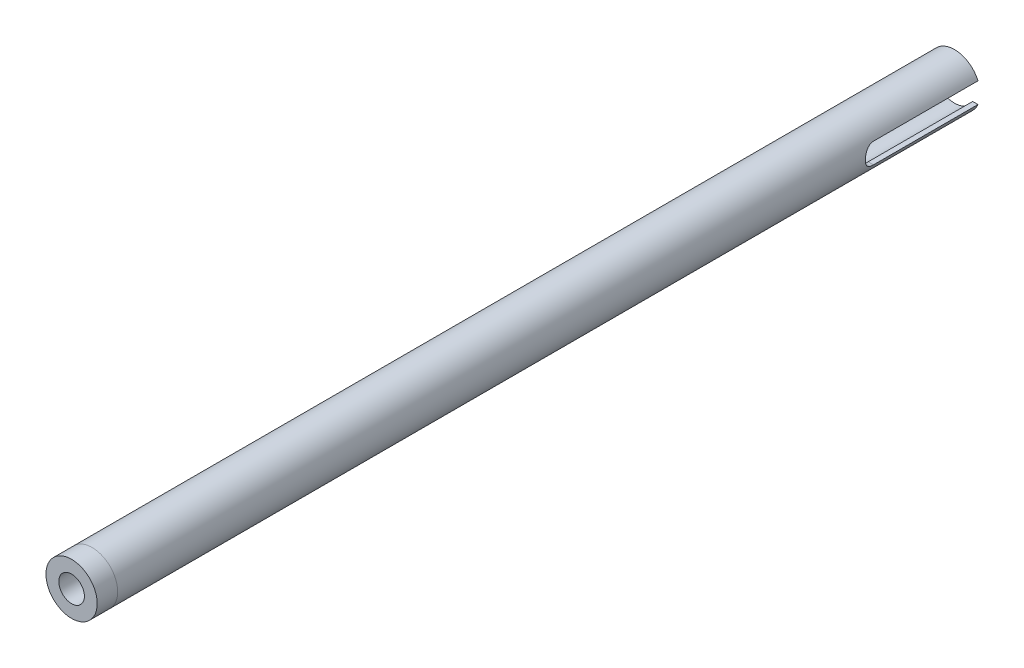
ISO-10303-21;
HEADER;
FILE_DESCRIPTION(('STEP AP214'),'2;1');
FILE_NAME('part.step','',(''),(''),'','','');
FILE_SCHEMA(('AUTOMOTIVE_DESIGN { 1 0 10303 214 1 1 1 1 }'));
ENDSEC;
DATA;
#1=APPLICATION_CONTEXT('core data for automotive mechanical design processes');
#2=APPLICATION_PROTOCOL_DEFINITION('international standard','automotive_design',2000,#1);
#3=PRODUCT_CONTEXT('',#1,'mechanical');
#4=PRODUCT('Part','Part','',(#3));
#5=PRODUCT_RELATED_PRODUCT_CATEGORY('part','',(#4));
#6=PRODUCT_DEFINITION_FORMATION('','',#4);
#7=PRODUCT_DEFINITION_CONTEXT('part definition',#1,'design');
#8=PRODUCT_DEFINITION('design','',#6,#7);
#9=PRODUCT_DEFINITION_SHAPE('','',#8);
#10=(LENGTH_UNIT() NAMED_UNIT(*) SI_UNIT(.MILLI.,.METRE.));
#11=(NAMED_UNIT(*) PLANE_ANGLE_UNIT() SI_UNIT($,.RADIAN.));
#12=(NAMED_UNIT(*) SI_UNIT($,.STERADIAN.) SOLID_ANGLE_UNIT());
#13=UNCERTAINTY_MEASURE_WITH_UNIT(LENGTH_MEASURE(1.E-05),#10,'distance_accuracy_value','');
#14=(GEOMETRIC_REPRESENTATION_CONTEXT(3) GLOBAL_UNCERTAINTY_ASSIGNED_CONTEXT((#13)) GLOBAL_UNIT_ASSIGNED_CONTEXT((#10,
#11,#12)) REPRESENTATION_CONTEXT('',''));
#15=CARTESIAN_POINT('',(0.,0.,0.));
#16=DIRECTION('',(0.,0.,1.));
#17=DIRECTION('',(1.,0.,0.));
#18=AXIS2_PLACEMENT_3D('',#15,#16,#17);
#19=CARTESIAN_POINT('',(0.,0.,-273.485359932268));
#20=DIRECTION('',(0.,0.,1.));
#21=DIRECTION('',(1.,0.,0.));
#22=AXIS2_PLACEMENT_3D('',#19,#20,#21);
#23=CYLINDRICAL_SURFACE('',#22,7.9375);
#24=CARTESIAN_POINT('',(0.,0.,-6.35));
#25=DIRECTION('',(0.,0.,1.));
#26=DIRECTION('',(1.,0.,0.));
#27=AXIS2_PLACEMENT_3D('',#24,#25,#26);
#28=CIRCLE('',#27,7.9375);
#29=CARTESIAN_POINT('',(7.9375,0.,-6.35));
#30=VERTEX_POINT('',#29);
#31=EDGE_CURVE('E165',#30,#30,#28,.T.);
#32=ORIENTED_EDGE('',*,*,#31,.F.);
#33=EDGE_LOOP('',(#32));
#34=FACE_BOUND('',#33,.T.);
#35=CARTESIAN_POINT('',(-7.2748389157424,3.175,-241.100359932268));
#36=CARTESIAN_POINT('',(-7.27482137043434,3.17501267173453,-241.014939816786));
#37=CARTESIAN_POINT('',(-7.27634297592672,3.17155313247793,-240.929529287223));
#38=CARTESIAN_POINT('',(-7.28233338484875,3.15778866907725,-240.759397282895));
#39=CARTESIAN_POINT('',(-7.28680106535325,3.14748635311323,-240.674675558036));
#40=CARTESIAN_POINT('',(-7.29852916312671,3.12019002880163,-240.506861858227));
#41=CARTESIAN_POINT('',(-7.30577831906487,3.10322299732752,-240.423764713468));
#42=CARTESIAN_POINT('',(-7.32282161153745,3.06278779397034,-240.259453611442));
#43=CARTESIAN_POINT('',(-7.33261590324725,3.03931922568673,-240.178239769329));
#44=CARTESIAN_POINT('',(-7.36535331460444,2.9595292434296,-239.938414946746));
#45=CARTESIAN_POINT('',(-7.3916759567784,2.89376893609236,-239.783290017943));
#46=CARTESIAN_POINT('',(-7.45033259991548,2.73920602658921,-239.486202591231));
#47=CARTESIAN_POINT('',(-7.48267254395243,2.65038060922871,-239.344253316014));
#48=CARTESIAN_POINT('',(-7.55175295441386,2.44684429809695,-239.069532546494));
#49=CARTESIAN_POINT('',(-7.58863404630154,2.33103943595689,-238.937605161982));
#50=CARTESIAN_POINT('',(-7.66147718953598,2.07914562663536,-238.69444227835));
#51=CARTESIAN_POINT('',(-7.69743902899202,1.94305205135847,-238.583211513423));
#52=CARTESIAN_POINT('',(-7.76611692840652,1.64778282664419,-238.380290313927));
#53=CARTESIAN_POINT('',(-7.79864638434712,1.48790317306356,-238.289555902523));
#54=CARTESIAN_POINT('',(-7.85502980346525,1.15369615984564,-238.136698349106));
#55=CARTESIAN_POINT('',(-7.87889360585224,0.979385463602719,-238.074542736488));
#56=CARTESIAN_POINT('',(-7.91022225039827,0.670405323433344,-237.994031092832));
#57=CARTESIAN_POINT('',(-7.92038443902171,0.537888188660429,-237.968353169423));
#58=CARTESIAN_POINT('',(-7.93061686811603,0.337231082382099,-237.942598086342));
#59=CARTESIAN_POINT('',(-7.93319257341971,0.269991647180292,-237.936139989061));
#60=CARTESIAN_POINT('',(-7.93663621925193,0.135173873369592,-237.927518971309));
#61=CARTESIAN_POINT('',(-7.93750363389236,0.0675954368175841,-237.925357373491));
#62=CARTESIAN_POINT('',(-7.9375,0.,-237.925359932268));
#63=B_SPLINE_CURVE_WITH_KNOTS('',3,(#35,#36,#37,#38,#39,#40,#41,#42,#43,#44,#45,#46,#47,#48,#49,
#50,#51,#52,#53,#54,#55,#56,#57,#58,#59,#60,#61,#62),.UNSPECIFIED.,.F.,.F.,(4,2,2,2,2,2,2,2,2,2,
2,2,2,4),(0.,0.25616079739664,0.512224013007086,0.767261264672294,1.02231406945474,
1.53142416248601,2.041039780479,2.57679273649399,3.11266809162684,3.66991136029741,
4.22651992730647,4.63134321412667,4.83399375866621,5.03670667834029),.UNSPECIFIED.);
#64=CARTESIAN_POINT('',(-7.2748389157424,3.175,-241.100359932268));
#65=VERTEX_POINT('',#64);
#66=CARTESIAN_POINT('',(-7.9375,0.,-237.925359932268));
#67=VERTEX_POINT('',#66);
#68=EDGE_CURVE('E192',#65,#67,#63,.T.);
#69=ORIENTED_EDGE('',*,*,#68,.T.);
#70=CARTESIAN_POINT('',(-7.9375,0.,-237.925359932268));
#71=CARTESIAN_POINT('',(-7.93751279435796,-0.0856973243893161,-237.925347902099));
#72=CARTESIAN_POINT('',(-7.93611246860092,-0.171386675169289,-237.928829269571));
#73=CARTESIAN_POINT('',(-7.93058107051394,-0.342092796869087,-237.942685364906));
#74=CARTESIAN_POINT('',(-7.92645080745519,-0.427109759557717,-237.953058049889));
#75=CARTESIAN_POINT('',(-7.91557399086504,-0.595570690948318,-237.980555243956));
#76=CARTESIAN_POINT('',(-7.90883664469869,-0.679019123580009,-237.997655995229));
#77=CARTESIAN_POINT('',(-7.89293284658536,-0.844038966454647,-238.038423242703));
#78=CARTESIAN_POINT('',(-7.88376629739099,-0.925610301410308,-238.062090001759));
#79=CARTESIAN_POINT('',(-7.8529700783248,-1.16656173687589,-238.142597657458));
#80=CARTESIAN_POINT('',(-7.82802544143957,-1.32244720282991,-238.208990290335));
#81=CARTESIAN_POINT('',(-7.77174407779742,-1.6208190257289,-238.365035694328));
#82=CARTESIAN_POINT('',(-7.74040257287306,-1.76329524966532,-238.454705866391));
#83=CARTESIAN_POINT('',(-7.67287736621953,-2.03755465224645,-238.659159473906));
#84=CARTESIAN_POINT('',(-7.63654472176442,-2.16862853615059,-238.774846330638));
#85=CARTESIAN_POINT('',(-7.56380976030912,-2.41011022612819,-239.026140432347));
#86=CARTESIAN_POINT('',(-7.52740741976911,-2.52050895891189,-239.161756376829));
#87=CARTESIAN_POINT('',(-7.45683282624283,-2.72240939900244,-239.456454871696));
#88=CARTESIAN_POINT('',(-7.42283467350379,-2.81283701743192,-239.616318861611));
#89=CARTESIAN_POINT('',(-7.36333622196319,-2.9651189416839,-239.950444826408));
#90=CARTESIAN_POINT('',(-7.33782422493328,-3.02701262758154,-240.124686564167));
#91=CARTESIAN_POINT('',(-7.30424985403508,-3.10695047193343,-240.432990288818));
#92=CARTESIAN_POINT('',(-7.29331360019112,-3.13238569878911,-240.564849049704));
#93=CARTESIAN_POINT('',(-7.2822797767429,-3.15790858319002,-240.764565931398));
#94=CARTESIAN_POINT('',(-7.27949685702346,-3.16431127275807,-240.831514222158));
#95=CARTESIAN_POINT('',(-7.27577355567174,-3.17285909036155,-240.965755780024));
#96=CARTESIAN_POINT('',(-7.27483380475762,-3.17500276099679,-241.033049157322));
#97=CARTESIAN_POINT('',(-7.2748389157424,-3.175,-241.100359932268));
#98=B_SPLINE_CURVE_WITH_KNOTS('',3,(#70,#71,#72,#73,#74,#75,#76,#77,#78,#79,#80,#81,#82,#83,#84,
#85,#86,#87,#88,#89,#90,#91,#92,#93,#94,#95,#96,#97),.UNSPECIFIED.,.F.,.F.,(4,2,2,2,2,2,2,2,2,2,
2,2,2,4),(0.,0.256996432008006,0.513916713336977,0.769937797705395,1.02596913282158,
1.53722547809955,2.04886511530061,2.58219314099272,3.115754672018,3.67332953074265,
4.23013255190376,4.63306130520187,4.83485003827449,5.03670780985621),.UNSPECIFIED.);
#99=CARTESIAN_POINT('',(-7.2748389157424,-3.175,-241.100359932268));
#100=VERTEX_POINT('',#99);
#101=EDGE_CURVE('E144',#67,#100,#98,.T.);
#102=ORIENTED_EDGE('',*,*,#101,.T.);
#103=DIRECTION('',(0.,0.,-1.));
#104=VECTOR('',#103,1.);
#105=CARTESIAN_POINT('',(-7.2748389157424,-3.175,-237.925359932268));
#106=LINE('',#105,#104);
#107=CARTESIAN_POINT('',(-7.2748389157424,-3.175,-273.485359932268));
#108=VERTEX_POINT('',#107);
#109=EDGE_CURVE('E139',#100,#108,#106,.T.);
#110=ORIENTED_EDGE('',*,*,#109,.T.);
#111=CARTESIAN_POINT('',(0.,0.,-273.485359932268));
#112=DIRECTION('',(0.,0.,1.));
#113=DIRECTION('',(1.,0.,0.));
#114=AXIS2_PLACEMENT_3D('',#111,#112,#113);
#115=CIRCLE('',#114,7.9375);
#116=CARTESIAN_POINT('',(7.2748389157424,-3.175,-273.485359932268));
#117=VERTEX_POINT('',#116);
#118=EDGE_CURVE('E142',#108,#117,#115,.T.);
#119=ORIENTED_EDGE('',*,*,#118,.T.);
#120=DIRECTION('',(0.,0.,-1.));
#121=VECTOR('',#120,1.);
#122=CARTESIAN_POINT('',(7.2748389157424,-3.175,-237.925359932268));
#123=LINE('',#122,#121);
#124=CARTESIAN_POINT('',(7.2748389157424,-3.175,-241.100359932268));
#125=VERTEX_POINT('',#124);
#126=EDGE_CURVE('E425',#125,#117,#123,.T.);
#127=ORIENTED_EDGE('',*,*,#126,.F.);
#128=CARTESIAN_POINT('',(7.2748389157424,-3.175,-241.100359932268));
#129=CARTESIAN_POINT('',(7.27482137043434,-3.17501267173453,-241.014939816786));
#130=CARTESIAN_POINT('',(7.27634297592672,-3.17155313247793,-240.929529287223));
#131=CARTESIAN_POINT('',(7.28233338484875,-3.15778866907725,-240.759397282895));
#132=CARTESIAN_POINT('',(7.28680106535325,-3.14748635311323,-240.674675558036));
#133=CARTESIAN_POINT('',(7.29852916312671,-3.12019002880163,-240.506861858227));
#134=CARTESIAN_POINT('',(7.30577831906487,-3.10322299732752,-240.423764713468));
#135=CARTESIAN_POINT('',(7.32282161153745,-3.06278779397034,-240.259453611442));
#136=CARTESIAN_POINT('',(7.33261590324725,-3.03931922568673,-240.178239769329));
#137=CARTESIAN_POINT('',(7.36535331460444,-2.9595292434296,-239.938414946746));
#138=CARTESIAN_POINT('',(7.3916759567784,-2.89376893609236,-239.783290017943));
#139=CARTESIAN_POINT('',(7.45033259991548,-2.73920602658921,-239.486202591231));
#140=CARTESIAN_POINT('',(7.48267254395243,-2.65038060922871,-239.344253316014));
#141=CARTESIAN_POINT('',(7.55175295441386,-2.44684429809695,-239.069532546494));
#142=CARTESIAN_POINT('',(7.58863404630154,-2.33103943595689,-238.937605161982));
#143=CARTESIAN_POINT('',(7.66147718953598,-2.07914562663536,-238.69444227835));
#144=CARTESIAN_POINT('',(7.69743902899202,-1.94305205135847,-238.583211513423));
#145=CARTESIAN_POINT('',(7.76611692840652,-1.64778282664419,-238.380290313927));
#146=CARTESIAN_POINT('',(7.79864638434712,-1.48790317306356,-238.289555902523));
#147=CARTESIAN_POINT('',(7.85502980346525,-1.15369615984564,-238.136698349106));
#148=CARTESIAN_POINT('',(7.87889360585224,-0.979385463602719,-238.074542736488));
#149=CARTESIAN_POINT('',(7.91022225039827,-0.670405323433344,-237.994031092832));
#150=CARTESIAN_POINT('',(7.92038443902171,-0.537888188660429,-237.968353169423));
#151=CARTESIAN_POINT('',(7.93061686811603,-0.337231082382099,-237.942598086342));
#152=CARTESIAN_POINT('',(7.93319257341971,-0.269991647180292,-237.936139989061));
#153=CARTESIAN_POINT('',(7.93663621925193,-0.135173873369592,-237.927518971309));
#154=CARTESIAN_POINT('',(7.93750363389236,-0.0675954368175841,-237.925357373491));
#155=CARTESIAN_POINT('',(7.9375,0.,-237.925359932268));
#156=B_SPLINE_CURVE_WITH_KNOTS('',3,(#128,#129,#130,#131,#132,#133,#134,#135,#136,#137,#138,
#139,#140,#141,#142,#143,#144,#145,#146,#147,#148,#149,#150,#151,#152,#153,#154,#155),
.UNSPECIFIED.,.F.,.F.,(4,2,2,2,2,2,2,2,2,2,2,2,2,4),(0.,0.25616079739664,0.512224013007086,
0.767261264672294,1.02231406945474,1.53142416248601,2.041039780479,2.57679273649399,
3.11266809162684,3.66991136029741,4.22651992730647,4.63134321412667,4.83399375866621,
5.03670667834029),.UNSPECIFIED.);
#157=CARTESIAN_POINT('',(7.9375,0.,-237.925359932268));
#158=VERTEX_POINT('',#157);
#159=EDGE_CURVE('E85',#125,#158,#156,.T.);
#160=ORIENTED_EDGE('',*,*,#159,.T.);
#161=CARTESIAN_POINT('',(7.9375,0.,-237.925359932268));
#162=CARTESIAN_POINT('',(7.93751279435796,0.0856973243893161,-237.925347902099));
#163=CARTESIAN_POINT('',(7.93611246860092,0.171386675169289,-237.928829269571));
#164=CARTESIAN_POINT('',(7.93058107051394,0.342092796869087,-237.942685364906));
#165=CARTESIAN_POINT('',(7.92645080745519,0.427109759557717,-237.953058049889));
#166=CARTESIAN_POINT('',(7.91557399086504,0.595570690948318,-237.980555243956));
#167=CARTESIAN_POINT('',(7.90883664469869,0.679019123580009,-237.997655995229));
#168=CARTESIAN_POINT('',(7.89293284658536,0.844038966454647,-238.038423242703));
#169=CARTESIAN_POINT('',(7.88376629739099,0.925610301410308,-238.062090001759));
#170=CARTESIAN_POINT('',(7.8529700783248,1.16656173687589,-238.142597657458));
#171=CARTESIAN_POINT('',(7.82802544143957,1.32244720282991,-238.208990290335));
#172=CARTESIAN_POINT('',(7.77174407779742,1.6208190257289,-238.365035694328));
#173=CARTESIAN_POINT('',(7.74040257287306,1.76329524966532,-238.454705866391));
#174=CARTESIAN_POINT('',(7.67287736621953,2.03755465224645,-238.659159473906));
#175=CARTESIAN_POINT('',(7.63654472176442,2.16862853615059,-238.774846330638));
#176=CARTESIAN_POINT('',(7.56380976030912,2.41011022612819,-239.026140432347));
#177=CARTESIAN_POINT('',(7.52740741976911,2.52050895891189,-239.161756376829));
#178=CARTESIAN_POINT('',(7.45683282624283,2.72240939900244,-239.456454871696));
#179=CARTESIAN_POINT('',(7.42283467350379,2.81283701743192,-239.616318861611));
#180=CARTESIAN_POINT('',(7.36333622196319,2.9651189416839,-239.950444826408));
#181=CARTESIAN_POINT('',(7.33782422493328,3.02701262758154,-240.124686564167));
#182=CARTESIAN_POINT('',(7.30424985403508,3.10695047193343,-240.432990288818));
#183=CARTESIAN_POINT('',(7.29331360019112,3.13238569878911,-240.564849049704));
#184=CARTESIAN_POINT('',(7.2822797767429,3.15790858319002,-240.764565931398));
#185=CARTESIAN_POINT('',(7.27949685702346,3.16431127275807,-240.831514222158));
#186=CARTESIAN_POINT('',(7.27577355567174,3.17285909036155,-240.965755780024));
#187=CARTESIAN_POINT('',(7.27483380475762,3.17500276099679,-241.033049157322));
#188=CARTESIAN_POINT('',(7.2748389157424,3.175,-241.100359932268));
#189=B_SPLINE_CURVE_WITH_KNOTS('',3,(#161,#162,#163,#164,#165,#166,#167,#168,#169,#170,#171,
#172,#173,#174,#175,#176,#177,#178,#179,#180,#181,#182,#183,#184,#185,#186,#187,#188),
.UNSPECIFIED.,.F.,.F.,(4,2,2,2,2,2,2,2,2,2,2,2,2,4),(0.,0.256996432008006,0.513916713336977,
0.769937797705395,1.02596913282158,1.53722547809955,2.04886511530061,2.58219314099272,
3.115754672018,3.67332953074265,4.23013255190376,4.63306130520187,4.83485003827449,
5.03670780985621),.UNSPECIFIED.);
#190=CARTESIAN_POINT('',(7.2748389157424,3.175,-241.100359932268));
#191=VERTEX_POINT('',#190);
#192=EDGE_CURVE('E71',#158,#191,#189,.T.);
#193=ORIENTED_EDGE('',*,*,#192,.T.);
#194=DIRECTION('',(0.,0.,-1.));
#195=VECTOR('',#194,1.);
#196=CARTESIAN_POINT('',(7.2748389157424,3.175,-237.925359932268));
#197=LINE('',#196,#195);
#198=CARTESIAN_POINT('',(7.2748389157424,3.175,-273.485359932268));
#199=VERTEX_POINT('',#198);
#200=EDGE_CURVE('E158',#191,#199,#197,.T.);
#201=ORIENTED_EDGE('',*,*,#200,.T.);
#202=CARTESIAN_POINT('',(-7.2748389157424,3.175,-273.485359932268));
#203=VERTEX_POINT('',#202);
#204=EDGE_CURVE('E164',#199,#203,#115,.T.);
#205=ORIENTED_EDGE('',*,*,#204,.T.);
#206=DIRECTION('',(0.,0.,-1.));
#207=VECTOR('',#206,1.);
#208=CARTESIAN_POINT('',(-7.2748389157424,3.175,-237.925359932268));
#209=LINE('',#208,#207);
#210=EDGE_CURVE('E418',#65,#203,#209,.T.);
#211=ORIENTED_EDGE('',*,*,#210,.F.);
#212=EDGE_LOOP('',(#69,#102,#110,#119,#127,#160,#193,#201,#205,#211));
#213=FACE_BOUND('',#212,.T.);
#214=ADVANCED_FACE('F61',(#34,#213),#23,.T.);
#215=CARTESIAN_POINT('',(0.,0.,-273.485359932268));
#216=DIRECTION('',(0.,0.,1.));
#217=DIRECTION('',(1.,0.,0.));
#218=AXIS2_PLACEMENT_3D('',#215,#216,#217);
#219=PLANE('',#218);
#220=DIRECTION('',(1.,0.,0.));
#221=VECTOR('',#220,1.);
#222=CARTESIAN_POINT('',(0.,-3.175,-273.485359932268));
#223=LINE('',#222,#221);
#224=CARTESIAN_POINT('',(-5.63085690548073,-3.175,-273.485359932268));
#225=VERTEX_POINT('',#224);
#226=EDGE_CURVE('E151',#108,#225,#223,.T.);
#227=ORIENTED_EDGE('',*,*,#226,.T.);
#228=CARTESIAN_POINT('',(0.,0.,-273.485359932268));
#229=DIRECTION('',(0.,0.,1.));
#230=DIRECTION('',(1.,0.,0.));
#231=AXIS2_PLACEMENT_3D('',#228,#229,#230);
#232=CIRCLE('',#231,6.4643);
#233=CARTESIAN_POINT('',(5.63085690548073,-3.175,-273.485359932268));
#234=VERTEX_POINT('',#233);
#235=EDGE_CURVE('E273',#225,#234,#232,.T.);
#236=ORIENTED_EDGE('',*,*,#235,.T.);
#237=DIRECTION('',(1.,0.,0.));
#238=VECTOR('',#237,1.);
#239=CARTESIAN_POINT('',(0.,-3.175,-273.485359932268));
#240=LINE('',#239,#238);
#241=EDGE_CURVE('E163',#234,#117,#240,.T.);
#242=ORIENTED_EDGE('',*,*,#241,.T.);
#243=ORIENTED_EDGE('',*,*,#118,.F.);
#244=EDGE_LOOP('',(#227,#236,#242,#243));
#245=FACE_BOUND('',#244,.T.);
#246=ADVANCED_FACE('F161',(#245),#219,.F.);
#247=CARTESIAN_POINT('',(0.,0.,-273.485359932268));
#248=DIRECTION('',(0.,0.,1.));
#249=DIRECTION('',(1.,0.,0.));
#250=AXIS2_PLACEMENT_3D('',#247,#248,#249);
#251=CYLINDRICAL_SURFACE('',#250,6.4643);
#252=CARTESIAN_POINT('',(0.,0.,-6.35));
#253=DIRECTION('',(0.,0.,1.));
#254=DIRECTION('',(1.,0.,0.));
#255=AXIS2_PLACEMENT_3D('',#252,#253,#254);
#256=CIRCLE('',#255,6.4643);
#257=CARTESIAN_POINT('',(6.4643,0.,-6.35));
#258=VERTEX_POINT('',#257);
#259=EDGE_CURVE('E147',#258,#258,#256,.T.);
#260=ORIENTED_EDGE('',*,*,#259,.T.);
#261=EDGE_LOOP('',(#260));
#262=FACE_BOUND('',#261,.T.);
#263=DIRECTION('',(0.,0.,-1.));
#264=VECTOR('',#263,1.);
#265=CARTESIAN_POINT('',(-5.63085690548073,-3.175,-237.925359932268));
#266=LINE('',#265,#264);
#267=CARTESIAN_POINT('',(-5.63085690548073,-3.175,-241.100359932268));
#268=VERTEX_POINT('',#267);
#269=EDGE_CURVE('E148',#268,#225,#266,.T.);
#270=ORIENTED_EDGE('',*,*,#269,.F.);
#271=CARTESIAN_POINT('',(-5.63085690548073,-3.175,-241.100359932268));
#272=CARTESIAN_POINT('',(-5.63083313994649,-3.17501475983035,-241.016983097548));
#273=CARTESIAN_POINT('',(-5.63270815771784,-3.17171623434453,-240.933619422379));
#274=CARTESIAN_POINT('',(-5.64007695954704,-3.15860868668088,-240.767614280283));
#275=CARTESIAN_POINT('',(-5.64556860910801,-3.14880350463521,-240.684972416484));
#276=CARTESIAN_POINT('',(-5.6599516035627,-3.12287177657853,-240.521469151814));
#277=CARTESIAN_POINT('',(-5.6688236064135,-3.10678118209034,-240.440600339634));
#278=CARTESIAN_POINT('',(-5.6896425308495,-3.06848763641646,-240.280742959907));
#279=CARTESIAN_POINT('',(-5.70158978762268,-3.04628401892209,-240.201754598347));
#280=CARTESIAN_POINT('',(-5.74141867016874,-2.9709479042579,-239.968696352386));
#281=CARTESIAN_POINT('',(-5.77333273238341,-2.90901346570841,-239.818059811752));
#282=CARTESIAN_POINT('',(-5.84425759514896,-2.76375418819102,-239.529204706917));
#283=CARTESIAN_POINT('',(-5.8832792534464,-2.68039654138928,-239.391005631854));
#284=CARTESIAN_POINT('',(-5.96775435279506,-2.48697819565357,-239.119064593615));
#285=CARTESIAN_POINT('',(-6.01347229172614,-2.37533204038058,-238.986529787266));
#286=CARTESIAN_POINT('',(-6.10404593063631,-2.13182339161096,-238.741154204188));
#287=CARTESIAN_POINT('',(-6.14890136897125,-1.99995486913047,-238.628319322209));
#288=CARTESIAN_POINT('',(-6.23619220514828,-1.70925564842438,-238.418335938289));
#289=CARTESIAN_POINT('',(-6.27828027392068,-1.54922894444791,-238.32268566256));
#290=CARTESIAN_POINT('',(-6.35178949400201,-1.21302302470907,-238.160301757343));
#291=CARTESIAN_POINT('',(-6.3832266631188,-1.03686857473501,-238.093524663539));
#292=CARTESIAN_POINT('',(-6.42590822780063,-0.717171909263562,-238.004092016231));
#293=CARTESIAN_POINT('',(-6.4401838278065,-0.575906031157518,-237.974703771308));
#294=CARTESIAN_POINT('',(-6.45458743188517,-0.361448476439089,-237.945171051647));
#295=CARTESIAN_POINT('',(-6.45822048728408,-0.289432204318641,-237.937751606886));
#296=CARTESIAN_POINT('',(-6.46308007773031,-0.144952050292009,-237.927843134726));
#297=CARTESIAN_POINT('',(-6.46430565210199,-0.0724880012714801,-237.92535607553));
#298=CARTESIAN_POINT('',(-6.4643,0.,-237.925359932268));
#299=B_SPLINE_CURVE_WITH_KNOTS('',3,(#271,#272,#273,#274,#275,#276,#277,#278,#279,#280,#281,
#282,#283,#284,#285,#286,#287,#288,#289,#290,#291,#292,#293,#294,#295,#296,#297,#298),
.UNSPECIFIED.,.F.,.F.,(4,2,2,2,2,2,2,2,2,2,2,2,2,4),(0.,0.250022608278555,0.499897788004003,
0.748364171658968,0.996857648438737,1.4924174038968,1.98874063697387,2.52413245916955,
3.05968421153495,3.63008006190819,4.19961425046546,4.63293550793414,4.85021333970387,
5.0675778559182),.UNSPECIFIED.);
#300=CARTESIAN_POINT('',(-6.4643,0.,-237.925359932268));
#301=VERTEX_POINT('',#300);
#302=EDGE_CURVE('E219',#268,#301,#299,.T.);
#303=ORIENTED_EDGE('',*,*,#302,.T.);
#304=CARTESIAN_POINT('',(-6.4643,0.,-237.925359932268));
#305=CARTESIAN_POINT('',(-6.46431471784482,0.08399476434355,-237.925346588142));
#306=CARTESIAN_POINT('',(-6.46266329267846,0.167980128010396,-237.928692687511));
#307=CARTESIAN_POINT('',(-6.45613851930725,0.335267070847881,-237.942000141114));
#308=CARTESIAN_POINT('',(-6.45126643524264,0.418568905327643,-237.951958899822));
#309=CARTESIAN_POINT('',(-6.4384393661228,0.583520093709587,-237.978328942291));
#310=CARTESIAN_POINT('',(-6.43049830091841,0.665175181914785,-237.994711096539));
#311=CARTESIAN_POINT('',(-6.41174605062734,0.826621713408843,-238.033728636293));
#312=CARTESIAN_POINT('',(-6.40093469346324,0.906413044651111,-238.056364396713));
#313=CARTESIAN_POINT('',(-6.3645999533627,1.14200454475576,-238.133263960805));
#314=CARTESIAN_POINT('',(-6.33514826225986,1.29435730209625,-238.196574593988));
#315=CARTESIAN_POINT('',(-6.26847721301058,1.5861501237047,-238.345066093818));
#316=CARTESIAN_POINT('',(-6.23125016174678,1.7255772002446,-238.430268640184));
#317=CARTESIAN_POINT('',(-6.14993667819984,1.99664965861336,-238.625782586313));
#318=CARTESIAN_POINT('',(-6.10557667432164,2.12736555519218,-238.737269445964));
#319=CARTESIAN_POINT('',(-6.01591119010693,2.36910305567939,-238.979671869146));
#320=CARTESIAN_POINT('',(-5.97060501254447,2.4801095192896,-239.110602228132));
#321=CARTESIAN_POINT('',(-5.88028635793905,2.68759195973766,-239.399924566875));
#322=CARTESIAN_POINT('',(-5.83554983812279,2.78235777578918,-239.559638669528));
#323=CARTESIAN_POINT('',(-5.75613746809778,2.94315382396594,-239.894989914104));
#324=CARTESIAN_POINT('',(-5.72144095718824,3.00924320962385,-240.070593365958));
#325=CARTESIAN_POINT('',(-5.67404956693615,3.09744900867388,-240.388597667644));
#326=CARTESIAN_POINT('',(-5.65804978215016,3.12636521602239,-240.528622357586));
#327=CARTESIAN_POINT('',(-5.64184153899281,3.15545749985709,-240.741370656196));
#328=CARTESIAN_POINT('',(-5.63773701667688,3.16277482388528,-240.812880544301));
#329=CARTESIAN_POINT('',(-5.63223913004552,3.17254960488947,-240.956371606072));
#330=CARTESIAN_POINT('',(-5.6308471601211,3.17500456237039,-241.028353003053));
#331=CARTESIAN_POINT('',(-5.63085690548073,3.175,-241.100359932268));
#332=B_SPLINE_CURVE_WITH_KNOTS('',3,(#304,#305,#306,#307,#308,#309,#310,#311,#312,#313,#314,
#315,#316,#317,#318,#319,#320,#321,#322,#323,#324,#325,#326,#327,#328,#329,#330,#331),
.UNSPECIFIED.,.F.,.F.,(4,2,2,2,2,2,2,2,2,2,2,2,2,4),(0.,0.251885801688014,0.503672794384371,
0.754330922106983,1.00500408047847,1.5053414676088,2.00617626510685,2.53624961383847,
3.06672840649525,3.63692439554961,4.20593853113135,4.63586569132643,4.85167139809471,
5.06758801082733),.UNSPECIFIED.);
#333=CARTESIAN_POINT('',(-5.63085690548073,3.175,-241.100359932268));
#334=VERTEX_POINT('',#333);
#335=EDGE_CURVE('E184',#301,#334,#332,.T.);
#336=ORIENTED_EDGE('',*,*,#335,.T.);
#337=DIRECTION('',(0.,0.,-1.));
#338=VECTOR('',#337,1.);
#339=CARTESIAN_POINT('',(-5.63085690548073,3.175,-237.925359932268));
#340=LINE('',#339,#338);
#341=CARTESIAN_POINT('',(-5.63085690548073,3.175,-273.485359932268));
#342=VERTEX_POINT('',#341);
#343=EDGE_CURVE('E415',#334,#342,#340,.T.);
#344=ORIENTED_EDGE('',*,*,#343,.T.);
#345=CARTESIAN_POINT('',(5.63085690548073,3.175,-273.485359932268));
#346=VERTEX_POINT('',#345);
#347=EDGE_CURVE('E170',#346,#342,#232,.T.);
#348=ORIENTED_EDGE('',*,*,#347,.F.);
#349=DIRECTION('',(0.,0.,-1.));
#350=VECTOR('',#349,1.);
#351=CARTESIAN_POINT('',(5.63085690548073,3.175,-237.925359932268));
#352=LINE('',#351,#350);
#353=CARTESIAN_POINT('',(5.63085690548073,3.175,-241.100359932268));
#354=VERTEX_POINT('',#353);
#355=EDGE_CURVE('E267',#354,#346,#352,.T.);
#356=ORIENTED_EDGE('',*,*,#355,.F.);
#357=CARTESIAN_POINT('',(5.63085690548073,3.175,-241.100359932268));
#358=CARTESIAN_POINT('',(5.63083313994649,3.17501475983035,-241.016983097548));
#359=CARTESIAN_POINT('',(5.63270815771784,3.17171623434453,-240.933619422379));
#360=CARTESIAN_POINT('',(5.64007695954704,3.15860868668088,-240.767614280283));
#361=CARTESIAN_POINT('',(5.64556860910801,3.14880350463521,-240.684972416484));
#362=CARTESIAN_POINT('',(5.6599516035627,3.12287177657853,-240.521469151814));
#363=CARTESIAN_POINT('',(5.6688236064135,3.10678118209034,-240.440600339634));
#364=CARTESIAN_POINT('',(5.6896425308495,3.06848763641646,-240.280742959907));
#365=CARTESIAN_POINT('',(5.70158978762268,3.04628401892209,-240.201754598347));
#366=CARTESIAN_POINT('',(5.74141867016874,2.9709479042579,-239.968696352386));
#367=CARTESIAN_POINT('',(5.77333273238341,2.90901346570841,-239.818059811752));
#368=CARTESIAN_POINT('',(5.84425759514896,2.76375418819102,-239.529204706917));
#369=CARTESIAN_POINT('',(5.8832792534464,2.68039654138928,-239.391005631854));
#370=CARTESIAN_POINT('',(5.96775435279506,2.48697819565357,-239.119064593615));
#371=CARTESIAN_POINT('',(6.01347229172614,2.37533204038058,-238.986529787266));
#372=CARTESIAN_POINT('',(6.10404593063631,2.13182339161096,-238.741154204188));
#373=CARTESIAN_POINT('',(6.14890136897125,1.99995486913047,-238.628319322209));
#374=CARTESIAN_POINT('',(6.23619220514828,1.70925564842438,-238.418335938289));
#375=CARTESIAN_POINT('',(6.27828027392068,1.54922894444791,-238.32268566256));
#376=CARTESIAN_POINT('',(6.35178949400201,1.21302302470907,-238.160301757343));
#377=CARTESIAN_POINT('',(6.3832266631188,1.03686857473501,-238.093524663539));
#378=CARTESIAN_POINT('',(6.42590822780063,0.717171909263562,-238.004092016231));
#379=CARTESIAN_POINT('',(6.4401838278065,0.575906031157518,-237.974703771308));
#380=CARTESIAN_POINT('',(6.45458743188517,0.361448476439089,-237.945171051647));
#381=CARTESIAN_POINT('',(6.45822048728408,0.289432204318641,-237.937751606886));
#382=CARTESIAN_POINT('',(6.46308007773031,0.144952050292009,-237.927843134726));
#383=CARTESIAN_POINT('',(6.46430565210199,0.0724880012714801,-237.92535607553));
#384=CARTESIAN_POINT('',(6.4643,0.,-237.925359932268));
#385=B_SPLINE_CURVE_WITH_KNOTS('',3,(#357,#358,#359,#360,#361,#362,#363,#364,#365,#366,#367,
#368,#369,#370,#371,#372,#373,#374,#375,#376,#377,#378,#379,#380,#381,#382,#383,#384),
.UNSPECIFIED.,.F.,.F.,(4,2,2,2,2,2,2,2,2,2,2,2,2,4),(0.,0.250022608278555,0.499897788004003,
0.748364171658968,0.996857648438737,1.4924174038968,1.98874063697387,2.52413245916955,
3.05968421153495,3.63008006190819,4.19961425046546,4.63293550793414,4.85021333970387,
5.0675778559182),.UNSPECIFIED.);
#386=CARTESIAN_POINT('',(6.4643,0.,-237.925359932268));
#387=VERTEX_POINT('',#386);
#388=EDGE_CURVE('E13',#354,#387,#385,.T.);
#389=ORIENTED_EDGE('',*,*,#388,.T.);
#390=CARTESIAN_POINT('',(6.4643,0.,-237.925359932268));
#391=CARTESIAN_POINT('',(6.46431471784482,-0.08399476434355,-237.925346588142));
#392=CARTESIAN_POINT('',(6.46266329267846,-0.167980128010396,-237.928692687511));
#393=CARTESIAN_POINT('',(6.45613851930725,-0.335267070847881,-237.942000141114));
#394=CARTESIAN_POINT('',(6.45126643524264,-0.418568905327643,-237.951958899822));
#395=CARTESIAN_POINT('',(6.4384393661228,-0.583520093709587,-237.978328942291));
#396=CARTESIAN_POINT('',(6.43049830091841,-0.665175181914785,-237.994711096539));
#397=CARTESIAN_POINT('',(6.41174605062734,-0.826621713408843,-238.033728636293));
#398=CARTESIAN_POINT('',(6.40093469346324,-0.906413044651111,-238.056364396713));
#399=CARTESIAN_POINT('',(6.3645999533627,-1.14200454475576,-238.133263960805));
#400=CARTESIAN_POINT('',(6.33514826225986,-1.29435730209625,-238.196574593988));
#401=CARTESIAN_POINT('',(6.26847721301058,-1.5861501237047,-238.345066093818));
#402=CARTESIAN_POINT('',(6.23125016174678,-1.7255772002446,-238.430268640184));
#403=CARTESIAN_POINT('',(6.14993667819984,-1.99664965861336,-238.625782586313));
#404=CARTESIAN_POINT('',(6.10557667432164,-2.12736555519218,-238.737269445964));
#405=CARTESIAN_POINT('',(6.01591119010693,-2.36910305567939,-238.979671869146));
#406=CARTESIAN_POINT('',(5.97060501254447,-2.4801095192896,-239.110602228132));
#407=CARTESIAN_POINT('',(5.88028635793905,-2.68759195973766,-239.399924566875));
#408=CARTESIAN_POINT('',(5.83554983812279,-2.78235777578918,-239.559638669528));
#409=CARTESIAN_POINT('',(5.75613746809778,-2.94315382396594,-239.894989914104));
#410=CARTESIAN_POINT('',(5.72144095718824,-3.00924320962385,-240.070593365958));
#411=CARTESIAN_POINT('',(5.67404956693615,-3.09744900867388,-240.388597667644));
#412=CARTESIAN_POINT('',(5.65804978215016,-3.12636521602239,-240.528622357586));
#413=CARTESIAN_POINT('',(5.64184153899281,-3.15545749985709,-240.741370656196));
#414=CARTESIAN_POINT('',(5.63773701667688,-3.16277482388528,-240.812880544301));
#415=CARTESIAN_POINT('',(5.63223913004552,-3.17254960488947,-240.956371606072));
#416=CARTESIAN_POINT('',(5.6308471601211,-3.17500456237039,-241.028353003053));
#417=CARTESIAN_POINT('',(5.63085690548073,-3.175,-241.100359932268));
#418=B_SPLINE_CURVE_WITH_KNOTS('',3,(#390,#391,#392,#393,#394,#395,#396,#397,#398,#399,#400,
#401,#402,#403,#404,#405,#406,#407,#408,#409,#410,#411,#412,#413,#414,#415,#416,#417),
.UNSPECIFIED.,.F.,.F.,(4,2,2,2,2,2,2,2,2,2,2,2,2,4),(0.,0.251885801688014,0.503672794384371,
0.754330922106983,1.00500408047847,1.5053414676088,2.00617626510685,2.53624961383847,
3.06672840649525,3.63692439554961,4.20593853113135,4.63586569132643,4.85167139809471,
5.06758801082733),.UNSPECIFIED.);
#419=CARTESIAN_POINT('',(5.63085690548073,-3.175,-241.100359932268));
#420=VERTEX_POINT('',#419);
#421=EDGE_CURVE('E235',#387,#420,#418,.T.);
#422=ORIENTED_EDGE('',*,*,#421,.T.);
#423=DIRECTION('',(0.,0.,-1.));
#424=VECTOR('',#423,1.);
#425=CARTESIAN_POINT('',(5.63085690548073,-3.175,-237.925359932268));
#426=LINE('',#425,#424);
#427=EDGE_CURVE('E269',#420,#234,#426,.T.);
#428=ORIENTED_EDGE('',*,*,#427,.T.);
#429=ORIENTED_EDGE('',*,*,#235,.F.);
#430=EDGE_LOOP('',(#270,#303,#336,#344,#348,#356,#389,#422,#428,#429));
#431=FACE_BOUND('',#430,.T.);
#432=ADVANCED_FACE('F199',(#262,#431),#251,.F.);
#433=ORIENTED_EDGE('',*,*,#347,.T.);
#434=DIRECTION('',(1.,0.,0.));
#435=VECTOR('',#434,1.);
#436=CARTESIAN_POINT('',(0.,3.175,-273.485359932268));
#437=LINE('',#436,#435);
#438=EDGE_CURVE('E157',#203,#342,#437,.T.);
#439=ORIENTED_EDGE('',*,*,#438,.F.);
#440=ORIENTED_EDGE('',*,*,#204,.F.);
#441=DIRECTION('',(1.,0.,0.));
#442=VECTOR('',#441,1.);
#443=CARTESIAN_POINT('',(0.,3.175,-273.485359932268));
#444=LINE('',#443,#442);
#445=EDGE_CURVE('E251',#346,#199,#444,.T.);
#446=ORIENTED_EDGE('',*,*,#445,.F.);
#447=EDGE_LOOP('',(#433,#439,#440,#446));
#448=FACE_BOUND('',#447,.T.);
#449=ADVANCED_FACE('F284',(#448),#219,.F.);
#450=CARTESIAN_POINT('',(0.,0.,-6.35));
#451=DIRECTION('',(0.,0.,1.));
#452=DIRECTION('',(1.,0.,0.));
#453=AXIS2_PLACEMENT_3D('',#450,#451,#452);
#454=PLANE('',#453);
#455=ORIENTED_EDGE('',*,*,#259,.F.);
#456=EDGE_LOOP('',(#455));
#457=FACE_BOUND('',#456,.T.);
#458=ORIENTED_EDGE('',*,*,#31,.T.);
#459=EDGE_LOOP('',(#458));
#460=FACE_BOUND('',#459,.T.);
#461=ADVANCED_FACE('F281',(#457,#460),#454,.T.);
#462=CARTESIAN_POINT('',(0.,3.175,-237.925359932268));
#463=DIRECTION('',(0.,1.,0.));
#464=DIRECTION('',(0.,0.,1.));
#465=AXIS2_PLACEMENT_3D('',#462,#463,#464);
#466=PLANE('',#465);
#467=ORIENTED_EDGE('',*,*,#200,.F.);
#468=DIRECTION('',(1.,0.,0.));
#469=VECTOR('',#468,1.);
#470=CARTESIAN_POINT('',(5.63085690548073,3.175,-241.100359932268));
#471=LINE('',#470,#469);
#472=EDGE_CURVE('E182',#191,#354,#471,.F.);
#473=ORIENTED_EDGE('',*,*,#472,.T.);
#474=ORIENTED_EDGE('',*,*,#355,.T.);
#475=ORIENTED_EDGE('',*,*,#445,.T.);
#476=EDGE_LOOP('',(#467,#473,#474,#475));
#477=FACE_BOUND('',#476,.T.);
#478=ADVANCED_FACE('F264',(#477),#466,.F.);
#479=CARTESIAN_POINT('',(0.,-3.175,-237.925359932268));
#480=DIRECTION('',(0.,1.,0.));
#481=DIRECTION('',(0.,0.,1.));
#482=AXIS2_PLACEMENT_3D('',#479,#480,#481);
#483=PLANE('',#482);
#484=ORIENTED_EDGE('',*,*,#427,.F.);
#485=DIRECTION('',(1.,0.,0.));
#486=VECTOR('',#485,1.);
#487=CARTESIAN_POINT('',(0.,-3.175,-241.100359932268));
#488=LINE('',#487,#486);
#489=EDGE_CURVE('E179',#420,#125,#488,.T.);
#490=ORIENTED_EDGE('',*,*,#489,.T.);
#491=ORIENTED_EDGE('',*,*,#126,.T.);
#492=ORIENTED_EDGE('',*,*,#241,.F.);
#493=EDGE_LOOP('',(#484,#490,#491,#492));
#494=FACE_BOUND('',#493,.T.);
#495=ADVANCED_FACE('F359',(#494),#483,.T.);
#496=CARTESIAN_POINT('',(0.,-3.175,-237.925359932268));
#497=DIRECTION('',(0.,1.,0.));
#498=DIRECTION('',(0.,0.,1.));
#499=AXIS2_PLACEMENT_3D('',#496,#497,#498);
#500=PLANE('',#499);
#501=ORIENTED_EDGE('',*,*,#109,.F.);
#502=DIRECTION('',(1.,0.,0.));
#503=VECTOR('',#502,1.);
#504=CARTESIAN_POINT('',(0.,-3.175,-241.100359932268));
#505=LINE('',#504,#503);
#506=EDGE_CURVE('E177',#100,#268,#505,.T.);
#507=ORIENTED_EDGE('',*,*,#506,.T.);
#508=ORIENTED_EDGE('',*,*,#269,.T.);
#509=ORIENTED_EDGE('',*,*,#226,.F.);
#510=EDGE_LOOP('',(#501,#507,#508,#509));
#511=FACE_BOUND('',#510,.T.);
#512=ADVANCED_FACE('F152',(#511),#500,.T.);
#513=CARTESIAN_POINT('',(0.,3.175,-237.925359932268));
#514=DIRECTION('',(0.,1.,0.));
#515=DIRECTION('',(0.,0.,1.));
#516=AXIS2_PLACEMENT_3D('',#513,#514,#515);
#517=PLANE('',#516);
#518=ORIENTED_EDGE('',*,*,#343,.F.);
#519=DIRECTION('',(1.,0.,0.));
#520=VECTOR('',#519,1.);
#521=CARTESIAN_POINT('',(-7.2748389157424,3.175,-241.100359932268));
#522=LINE('',#521,#520);
#523=EDGE_CURVE('E168',#334,#65,#522,.F.);
#524=ORIENTED_EDGE('',*,*,#523,.T.);
#525=ORIENTED_EDGE('',*,*,#210,.T.);
#526=ORIENTED_EDGE('',*,*,#438,.T.);
#527=EDGE_LOOP('',(#518,#524,#525,#526));
#528=FACE_BOUND('',#527,.T.);
#529=ADVANCED_FACE('F214',(#528),#517,.F.);
#530=CARTESIAN_POINT('',(0.,0.,-241.100359932268));
#531=DIRECTION('',(1.,0.,0.));
#532=DIRECTION('',(0.,0.,-1.));
#533=AXIS2_PLACEMENT_3D('',#530,#531,#532);
#534=CYLINDRICAL_SURFACE('',#533,3.175);
#535=ORIENTED_EDGE('',*,*,#506,.F.);
#536=ORIENTED_EDGE('',*,*,#101,.F.);
#537=DIRECTION('',(1.,0.,0.));
#538=VECTOR('',#537,1.);
#539=CARTESIAN_POINT('',(0.,0.,-237.925359932268));
#540=LINE('',#539,#538);
#541=EDGE_CURVE('E249',#301,#67,#540,.F.);
#542=ORIENTED_EDGE('',*,*,#541,.F.);
#543=ORIENTED_EDGE('',*,*,#302,.F.);
#544=EDGE_LOOP('',(#535,#536,#542,#543));
#545=FACE_BOUND('',#544,.T.);
#546=ADVANCED_FACE('F207',(#545),#534,.F.);
#547=CARTESIAN_POINT('',(0.,0.,-241.100359932268));
#548=DIRECTION('',(-1.,0.,0.));
#549=DIRECTION('',(0.,0.,1.));
#550=AXIS2_PLACEMENT_3D('',#547,#548,#549);
#551=CYLINDRICAL_SURFACE('',#550,3.175);
#552=ORIENTED_EDGE('',*,*,#68,.F.);
#553=ORIENTED_EDGE('',*,*,#523,.F.);
#554=ORIENTED_EDGE('',*,*,#335,.F.);
#555=ORIENTED_EDGE('',*,*,#541,.T.);
#556=EDGE_LOOP('',(#552,#553,#554,#555));
#557=FACE_BOUND('',#556,.T.);
#558=ADVANCED_FACE('F203',(#557),#551,.F.);
#559=CARTESIAN_POINT('',(0.,0.,-241.100359932268));
#560=DIRECTION('',(-1.,0.,0.));
#561=DIRECTION('',(0.,0.,1.));
#562=AXIS2_PLACEMENT_3D('',#559,#560,#561);
#563=CYLINDRICAL_SURFACE('',#562,3.175);
#564=DIRECTION('',(1.,0.,0.));
#565=VECTOR('',#564,1.);
#566=CARTESIAN_POINT('',(7.2748389157424,0.,-237.925359932268));
#567=LINE('',#566,#565);
#568=EDGE_CURVE('E66',#387,#158,#567,.T.);
#569=ORIENTED_EDGE('',*,*,#568,.F.);
#570=ORIENTED_EDGE('',*,*,#388,.F.);
#571=ORIENTED_EDGE('',*,*,#472,.F.);
#572=ORIENTED_EDGE('',*,*,#192,.F.);
#573=EDGE_LOOP('',(#569,#570,#571,#572));
#574=FACE_BOUND('',#573,.T.);
#575=ADVANCED_FACE('F63',(#574),#563,.F.);
#576=CARTESIAN_POINT('',(0.,0.,-241.100359932268));
#577=DIRECTION('',(1.,0.,0.));
#578=DIRECTION('',(0.,0.,-1.));
#579=AXIS2_PLACEMENT_3D('',#576,#577,#578);
#580=CYLINDRICAL_SURFACE('',#579,3.175);
#581=ORIENTED_EDGE('',*,*,#421,.F.);
#582=ORIENTED_EDGE('',*,*,#568,.T.);
#583=ORIENTED_EDGE('',*,*,#159,.F.);
#584=ORIENTED_EDGE('',*,*,#489,.F.);
#585=EDGE_LOOP('',(#581,#582,#583,#584));
#586=FACE_BOUND('',#585,.T.);
#587=ADVANCED_FACE('F216',(#586),#580,.F.);
#588=CLOSED_SHELL('',(#214,#246,#432,#449,#461,#478,#495,#512,#529,#546,#558,#575,#587));
#589=MANIFOLD_SOLID_BREP('B2',#588);
#590=CARTESIAN_POINT('',(0.,0.,-6.35));
#591=DIRECTION('',(0.,0.,1.));
#592=DIRECTION('',(1.,0.,0.));
#593=AXIS2_PLACEMENT_3D('',#590,#591,#592);
#594=CYLINDRICAL_SURFACE('',#593,7.9375);
#595=CARTESIAN_POINT('',(0.,0.,-6.35));
#596=DIRECTION('',(0.,0.,1.));
#597=DIRECTION('',(1.,0.,0.));
#598=AXIS2_PLACEMENT_3D('',#595,#596,#597);
#599=CIRCLE('',#598,7.9375);
#600=CARTESIAN_POINT('',(7.9375,0.,-6.35));
#601=VERTEX_POINT('',#600);
#602=EDGE_CURVE('E60',#601,#601,#599,.T.);
#603=ORIENTED_EDGE('',*,*,#602,.T.);
#604=EDGE_LOOP('',(#603));
#605=FACE_BOUND('',#604,.T.);
#606=CARTESIAN_POINT('',(0.,0.,0.));
#607=DIRECTION('',(0.,0.,1.));
#608=DIRECTION('',(1.,0.,0.));
#609=AXIS2_PLACEMENT_3D('',#606,#607,#608);
#610=CIRCLE('',#609,7.9375);
#611=CARTESIAN_POINT('',(7.9375,0.,0.));
#612=VERTEX_POINT('',#611);
#613=EDGE_CURVE('E463',#612,#612,#610,.T.);
#614=ORIENTED_EDGE('',*,*,#613,.F.);
#615=EDGE_LOOP('',(#614));
#616=FACE_BOUND('',#615,.T.);
#617=ADVANCED_FACE('F452',(#605,#616),#594,.T.);
#618=CARTESIAN_POINT('',(0.,0.,-6.35));
#619=DIRECTION('',(0.,0.,1.));
#620=DIRECTION('',(1.,0.,0.));
#621=AXIS2_PLACEMENT_3D('',#618,#619,#620);
#622=CYLINDRICAL_SURFACE('',#621,3.96875);
#623=CARTESIAN_POINT('',(0.,0.,0.));
#624=DIRECTION('',(0.,0.,1.));
#625=DIRECTION('',(1.,0.,0.));
#626=AXIS2_PLACEMENT_3D('',#623,#624,#625);
#627=CIRCLE('',#626,3.96875);
#628=CARTESIAN_POINT('',(3.96875,0.,0.));
#629=VERTEX_POINT('',#628);
#630=EDGE_CURVE('E455',#629,#629,#627,.T.);
#631=ORIENTED_EDGE('',*,*,#630,.T.);
#632=EDGE_LOOP('',(#631));
#633=FACE_BOUND('',#632,.T.);
#634=CARTESIAN_POINT('',(0.,0.,-15.875));
#635=DIRECTION('',(0.,0.,1.));
#636=DIRECTION('',(1.,0.,0.));
#637=AXIS2_PLACEMENT_3D('',#634,#635,#636);
#638=CIRCLE('',#637,3.96875);
#639=CARTESIAN_POINT('',(3.96875,0.,-15.875));
#640=VERTEX_POINT('',#639);
#641=EDGE_CURVE('E475',#640,#640,#638,.T.);
#642=ORIENTED_EDGE('',*,*,#641,.F.);
#643=EDGE_LOOP('',(#642));
#644=FACE_BOUND('',#643,.T.);
#645=ADVANCED_FACE('F483',(#633,#644),#622,.F.);
#646=CARTESIAN_POINT('',(0.,0.,-6.35));
#647=DIRECTION('',(0.,0.,1.));
#648=DIRECTION('',(1.,0.,0.));
#649=AXIS2_PLACEMENT_3D('',#646,#647,#648);
#650=PLANE('',#649);
#651=CARTESIAN_POINT('',(0.,0.,-6.35));
#652=DIRECTION('',(0.,0.,1.));
#653=DIRECTION('',(1.,0.,0.));
#654=AXIS2_PLACEMENT_3D('',#651,#652,#653);
#655=CIRCLE('',#654,6.4643);
#656=CARTESIAN_POINT('',(6.4643,0.,-6.35));
#657=VERTEX_POINT('',#656);
#658=EDGE_CURVE('E465',#657,#657,#655,.T.);
#659=ORIENTED_EDGE('',*,*,#658,.T.);
#660=EDGE_LOOP('',(#659));
#661=FACE_BOUND('',#660,.T.);
#662=ORIENTED_EDGE('',*,*,#602,.F.);
#663=EDGE_LOOP('',(#662));
#664=FACE_BOUND('',#663,.T.);
#665=ADVANCED_FACE('F485',(#661,#664),#650,.F.);
#666=CARTESIAN_POINT('',(0.,0.,0.));
#667=DIRECTION('',(0.,0.,1.));
#668=DIRECTION('',(1.,0.,0.));
#669=AXIS2_PLACEMENT_3D('',#666,#667,#668);
#670=PLANE('',#669);
#671=ORIENTED_EDGE('',*,*,#613,.T.);
#672=EDGE_LOOP('',(#671));
#673=FACE_BOUND('',#672,.T.);
#674=ORIENTED_EDGE('',*,*,#630,.F.);
#675=EDGE_LOOP('',(#674));
#676=FACE_BOUND('',#675,.T.);
#677=ADVANCED_FACE('F491',(#673,#676),#670,.T.);
#678=CARTESIAN_POINT('',(0.,0.,-15.875));
#679=DIRECTION('',(0.,0.,1.));
#680=DIRECTION('',(1.,0.,0.));
#681=AXIS2_PLACEMENT_3D('',#678,#679,#680);
#682=CYLINDRICAL_SURFACE('',#681,6.4643);
#683=CARTESIAN_POINT('',(0.,0.,-15.875));
#684=DIRECTION('',(0.,0.,1.));
#685=DIRECTION('',(1.,0.,0.));
#686=AXIS2_PLACEMENT_3D('',#683,#684,#685);
#687=CIRCLE('',#686,6.4643);
#688=CARTESIAN_POINT('',(6.4643,0.,-15.875));
#689=VERTEX_POINT('',#688);
#690=EDGE_CURVE('E468',#689,#689,#687,.T.);
#691=CARTESIAN_POINT('',(6.4643,0.,-15.875));
#692=CARTESIAN_POINT('',(6.4643,0.,-15.77578125));
#693=CARTESIAN_POINT('',(6.4643,0.,-15.6765625));
#694=CARTESIAN_POINT('',(6.4643,0.,-15.478125));
#695=CARTESIAN_POINT('',(6.4643,0.,-15.37890625));
#696=CARTESIAN_POINT('',(6.4643,0.,-15.18046875));
#697=CARTESIAN_POINT('',(6.4643,0.,-15.08125));
#698=CARTESIAN_POINT('',(6.4643,0.,-14.8828125));
#699=CARTESIAN_POINT('',(6.4643,0.,-14.78359375));
#700=CARTESIAN_POINT('',(6.4643,0.,-14.58515625));
#701=CARTESIAN_POINT('',(6.4643,0.,-14.4859375));
#702=CARTESIAN_POINT('',(6.4643,0.,-14.2875));
#703=CARTESIAN_POINT('',(6.4643,0.,-14.18828125));
#704=CARTESIAN_POINT('',(6.4643,0.,-13.98984375));
#705=CARTESIAN_POINT('',(6.4643,0.,-13.890625));
#706=CARTESIAN_POINT('',(6.4643,0.,-13.6921875));
#707=CARTESIAN_POINT('',(6.4643,0.,-13.59296875));
#708=CARTESIAN_POINT('',(6.4643,0.,-13.39453125));
#709=CARTESIAN_POINT('',(6.4643,0.,-13.2953125));
#710=CARTESIAN_POINT('',(6.4643,0.,-13.096875));
#711=CARTESIAN_POINT('',(6.4643,0.,-12.99765625));
#712=CARTESIAN_POINT('',(6.4643,0.,-12.79921875));
#713=CARTESIAN_POINT('',(6.4643,0.,-12.7));
#714=CARTESIAN_POINT('',(6.4643,0.,-12.5015625));
#715=CARTESIAN_POINT('',(6.4643,0.,-12.40234375));
#716=CARTESIAN_POINT('',(6.4643,0.,-12.20390625));
#717=CARTESIAN_POINT('',(6.4643,0.,-12.1046875));
#718=CARTESIAN_POINT('',(6.4643,0.,-11.90625));
#719=CARTESIAN_POINT('',(6.4643,0.,-11.80703125));
#720=CARTESIAN_POINT('',(6.4643,0.,-11.60859375));
#721=CARTESIAN_POINT('',(6.4643,0.,-11.509375));
#722=CARTESIAN_POINT('',(6.4643,0.,-11.3109375));
#723=CARTESIAN_POINT('',(6.4643,0.,-11.21171875));
#724=CARTESIAN_POINT('',(6.4643,0.,-11.01328125));
#725=CARTESIAN_POINT('',(6.4643,0.,-10.9140625));
#726=CARTESIAN_POINT('',(6.4643,0.,-10.715625));
#727=CARTESIAN_POINT('',(6.4643,0.,-10.61640625));
#728=CARTESIAN_POINT('',(6.4643,0.,-10.41796875));
#729=CARTESIAN_POINT('',(6.4643,0.,-10.31875));
#730=CARTESIAN_POINT('',(6.4643,0.,-10.1203125));
#731=CARTESIAN_POINT('',(6.4643,0.,-10.02109375));
#732=CARTESIAN_POINT('',(6.4643,0.,-9.82265625));
#733=CARTESIAN_POINT('',(6.4643,0.,-9.7234375));
#734=CARTESIAN_POINT('',(6.4643,0.,-9.525));
#735=CARTESIAN_POINT('',(6.4643,0.,-9.42578125));
#736=CARTESIAN_POINT('',(6.4643,0.,-9.22734375));
#737=CARTESIAN_POINT('',(6.4643,0.,-9.128125));
#738=CARTESIAN_POINT('',(6.4643,0.,-8.9296875));
#739=CARTESIAN_POINT('',(6.4643,0.,-8.83046875));
#740=CARTESIAN_POINT('',(6.4643,0.,-8.63203125));
#741=CARTESIAN_POINT('',(6.4643,0.,-8.5328125));
#742=CARTESIAN_POINT('',(6.4643,0.,-8.334375));
#743=CARTESIAN_POINT('',(6.4643,0.,-8.23515625));
#744=CARTESIAN_POINT('',(6.4643,0.,-8.03671875));
#745=CARTESIAN_POINT('',(6.4643,0.,-7.9375));
#746=CARTESIAN_POINT('',(6.4643,0.,-7.7390625));
#747=CARTESIAN_POINT('',(6.4643,0.,-7.63984375));
#748=CARTESIAN_POINT('',(6.4643,0.,-7.44140625));
#749=CARTESIAN_POINT('',(6.4643,0.,-7.3421875));
#750=CARTESIAN_POINT('',(6.4643,0.,-7.14375));
#751=CARTESIAN_POINT('',(6.4643,0.,-7.04453125));
#752=CARTESIAN_POINT('',(6.4643,0.,-6.84609375));
#753=CARTESIAN_POINT('',(6.4643,0.,-6.746875));
#754=CARTESIAN_POINT('',(6.4643,0.,-6.5484375));
#755=CARTESIAN_POINT('',(6.4643,0.,-6.44921875));
#756=CARTESIAN_POINT('',(6.4643,0.,-6.35));
#757=B_SPLINE_CURVE_WITH_KNOTS('',3,(#691,#692,#693,#694,#695,#696,#697,#698,#699,#700,#701,
#702,#703,#704,#705,#706,#707,#708,#709,#710,#711,#712,#713,#714,#715,#716,#717,#718,#719,#720,
#721,#722,#723,#724,#725,#726,#727,#728,#729,#730,#731,#732,#733,#734,#735,#736,#737,#738,#739,
#740,#741,#742,#743,#744,#745,#746,#747,#748,#749,#750,#751,#752,#753,#754,#755,#756),
.UNSPECIFIED.,.F.,.F.,(4,2,2,2,2,2,2,2,2,2,2,2,2,2,2,2,2,2,2,2,2,2,2,2,2,2,2,2,2,2,2,2,4),(0.,
0.297656249999998,0.595312499999999,0.892968749999999,1.190625,1.48828125,1.7859375,2.08359375,
2.38125,2.67890625,2.9765625,3.27421875,3.571875,3.86953125,4.1671875,4.46484375,4.7625,
5.06015625,5.3578125,5.65546875,5.953125,6.25078125,6.5484375,6.84609375,7.14375,7.44140625,
7.7390625,8.03671875,8.334375,8.63203125,8.9296875,9.22734375,9.525),.UNSPECIFIED.);
#758=EDGE_CURVE('BSEAM496',#689,#657,#757,.T.);
#759=ORIENTED_EDGE('',*,*,#690,.T.);
#760=ORIENTED_EDGE('',*,*,#658,.F.);
#761=ORIENTED_EDGE('',*,*,#758,.T.);
#762=ORIENTED_EDGE('',*,*,#758,.F.);
#763=EDGE_LOOP('',(#759,#761,#760,#762));
#764=FACE_BOUND('',#763,.T.);
#765=ADVANCED_FACE('F496',(#764),#682,.T.);
#766=CARTESIAN_POINT('',(0.,0.,-15.875));
#767=DIRECTION('',(0.,0.,1.));
#768=DIRECTION('',(1.,0.,0.));
#769=AXIS2_PLACEMENT_3D('',#766,#767,#768);
#770=PLANE('',#769);
#771=ORIENTED_EDGE('',*,*,#641,.T.);
#772=EDGE_LOOP('',(#771));
#773=FACE_BOUND('',#772,.T.);
#774=ORIENTED_EDGE('',*,*,#690,.F.);
#775=EDGE_LOOP('',(#774));
#776=FACE_BOUND('',#775,.T.);
#777=ADVANCED_FACE('F480',(#773,#776),#770,.F.);
#778=CLOSED_SHELL('',(#617,#645,#665,#677,#765,#777));
#779=MANIFOLD_SOLID_BREP('B7',#778);
#780=ADVANCED_BREP_SHAPE_REPRESENTATION('',(#18,#589,#779),#14);
#781=SHAPE_DEFINITION_REPRESENTATION(#9,#780);
ENDSEC;
END-ISO-10303-21;
